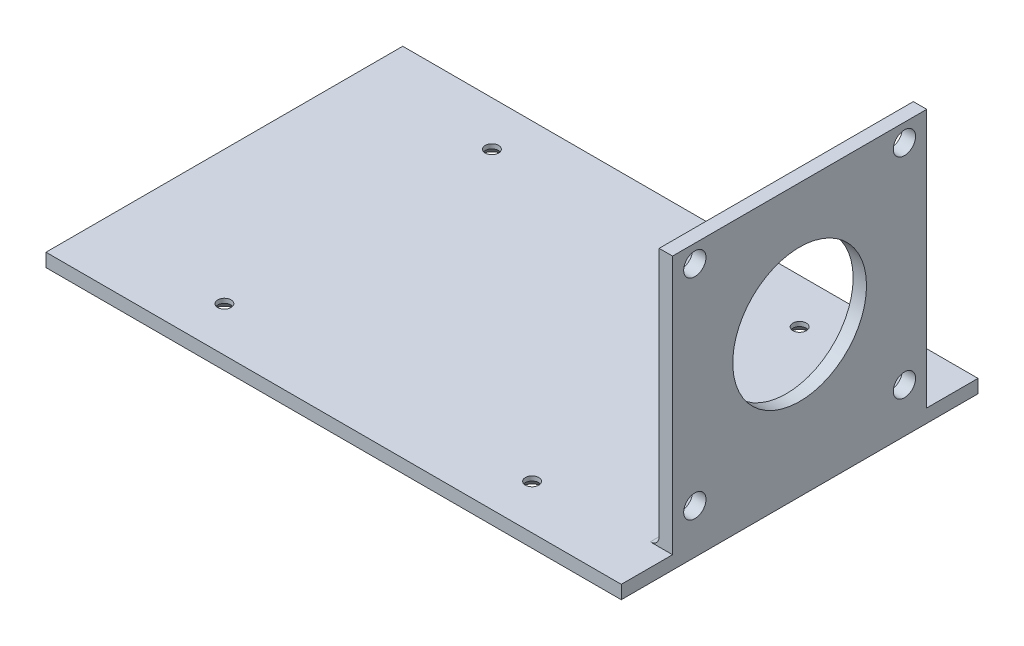
ISO-10303-21;
HEADER;
FILE_DESCRIPTION(('STEP AP214'),'2;1');
FILE_NAME('part.step','',(''),(''),'','','');
FILE_SCHEMA(('AUTOMOTIVE_DESIGN { 1 0 10303 214 1 1 1 1 }'));
ENDSEC;
DATA;
#1=APPLICATION_CONTEXT('core data for automotive mechanical design processes');
#2=APPLICATION_PROTOCOL_DEFINITION('international standard','automotive_design',2000,#1);
#3=PRODUCT_CONTEXT('',#1,'mechanical');
#4=PRODUCT('Part','Part','',(#3));
#5=PRODUCT_RELATED_PRODUCT_CATEGORY('part','',(#4));
#6=PRODUCT_DEFINITION_FORMATION('','',#4);
#7=PRODUCT_DEFINITION_CONTEXT('part definition',#1,'design');
#8=PRODUCT_DEFINITION('design','',#6,#7);
#9=PRODUCT_DEFINITION_SHAPE('','',#8);
#10=(LENGTH_UNIT() NAMED_UNIT(*) SI_UNIT(.MILLI.,.METRE.));
#11=(NAMED_UNIT(*) PLANE_ANGLE_UNIT() SI_UNIT($,.RADIAN.));
#12=(NAMED_UNIT(*) SI_UNIT($,.STERADIAN.) SOLID_ANGLE_UNIT());
#13=UNCERTAINTY_MEASURE_WITH_UNIT(LENGTH_MEASURE(1.E-05),#10,'distance_accuracy_value','');
#14=(GEOMETRIC_REPRESENTATION_CONTEXT(3) GLOBAL_UNCERTAINTY_ASSIGNED_CONTEXT((#13)) GLOBAL_UNIT_ASSIGNED_CONTEXT((#10,
#11,#12)) REPRESENTATION_CONTEXT('',''));
#15=CARTESIAN_POINT('',(0.,0.,0.));
#16=DIRECTION('',(0.,0.,1.));
#17=DIRECTION('',(1.,0.,0.));
#18=AXIS2_PLACEMENT_3D('',#15,#16,#17);
#19=CARTESIAN_POINT('',(129.,3.,0.));
#20=DIRECTION('',(-1.,0.,0.));
#21=DIRECTION('',(0.,0.,1.));
#22=AXIS2_PLACEMENT_3D('',#19,#20,#21);
#23=PLANE('',#22);
#24=CARTESIAN_POINT('',(129.,10.,-63.5));
#25=DIRECTION('',(-1.,0.,0.));
#26=DIRECTION('',(0.,0.,1.));
#27=AXIS2_PLACEMENT_3D('',#24,#25,#26);
#28=CIRCLE('',#27,2.5);
#29=CARTESIAN_POINT('',(129.,10.,-61.));
#30=VERTEX_POINT('',#29);
#31=EDGE_CURVE('E507',#30,#30,#28,.T.);
#32=ORIENTED_EDGE('',*,*,#31,.T.);
#33=EDGE_LOOP('',(#32));
#34=FACE_BOUND('',#33,.T.);
#35=CARTESIAN_POINT('',(129.,57.,-63.5));
#36=DIRECTION('',(1.,0.,0.));
#37=DIRECTION('',(0.,0.,-1.));
#38=AXIS2_PLACEMENT_3D('',#35,#36,#37);
#39=CIRCLE('',#38,2.5);
#40=CARTESIAN_POINT('',(129.,57.,-66.));
#41=VERTEX_POINT('',#40);
#42=EDGE_CURVE('E515',#41,#41,#39,.T.);
#43=ORIENTED_EDGE('',*,*,#42,.F.);
#44=EDGE_LOOP('',(#43));
#45=FACE_BOUND('',#44,.T.);
#46=DIRECTION('',(0.,0.,-1.));
#47=VECTOR('',#46,1.);
#48=CARTESIAN_POINT('',(129.,0.,0.));
#49=LINE('',#48,#47);
#50=CARTESIAN_POINT('',(129.,0.,0.));
#51=VERTEX_POINT('',#50);
#52=CARTESIAN_POINT('',(129.,0.,-80.));
#53=VERTEX_POINT('',#52);
#54=EDGE_CURVE('E165',#51,#53,#49,.T.);
#55=ORIENTED_EDGE('',*,*,#54,.T.);
#56=DIRECTION('',(0.,-1.,0.));
#57=VECTOR('',#56,1.);
#58=CARTESIAN_POINT('',(129.,3.,-80.));
#59=LINE('',#58,#57);
#60=CARTESIAN_POINT('',(129.,3.,-80.));
#61=VERTEX_POINT('',#60);
#62=EDGE_CURVE('E170',#61,#53,#59,.T.);
#63=ORIENTED_EDGE('',*,*,#62,.F.);
#64=DIRECTION('',(0.,0.,-1.));
#65=VECTOR('',#64,1.);
#66=CARTESIAN_POINT('',(129.,3.,0.));
#67=LINE('',#66,#65);
#68=CARTESIAN_POINT('',(129.,3.,-68.5));
#69=VERTEX_POINT('',#68);
#70=EDGE_CURVE('E155',#69,#61,#67,.T.);
#71=ORIENTED_EDGE('',*,*,#70,.F.);
#72=DIRECTION('',(0.,-1.,0.));
#73=VECTOR('',#72,1.);
#74=CARTESIAN_POINT('',(129.,61.,-68.5));
#75=LINE('',#74,#73);
#76=CARTESIAN_POINT('',(129.,61.,-68.5));
#77=VERTEX_POINT('',#76);
#78=EDGE_CURVE('E265',#77,#69,#75,.T.);
#79=ORIENTED_EDGE('',*,*,#78,.F.);
#80=DIRECTION('',(0.,0.,-1.));
#81=VECTOR('',#80,1.);
#82=CARTESIAN_POINT('',(129.,61.,-68.5));
#83=LINE('',#82,#81);
#84=CARTESIAN_POINT('',(129.,61.,-11.5));
#85=VERTEX_POINT('',#84);
#86=EDGE_CURVE('E125',#85,#77,#83,.T.);
#87=ORIENTED_EDGE('',*,*,#86,.F.);
#88=DIRECTION('',(0.,-1.,0.));
#89=VECTOR('',#88,1.);
#90=CARTESIAN_POINT('',(129.,61.,-11.5));
#91=LINE('',#90,#89);
#92=CARTESIAN_POINT('',(129.,3.,-11.5));
#93=VERTEX_POINT('',#92);
#94=EDGE_CURVE('E136',#85,#93,#91,.T.);
#95=ORIENTED_EDGE('',*,*,#94,.T.);
#96=CARTESIAN_POINT('',(129.,3.,0.));
#97=VERTEX_POINT('',#96);
#98=EDGE_CURVE('E156',#97,#93,#67,.T.);
#99=ORIENTED_EDGE('',*,*,#98,.F.);
#100=DIRECTION('',(0.,-1.,0.));
#101=VECTOR('',#100,1.);
#102=CARTESIAN_POINT('',(129.,3.,0.));
#103=LINE('',#102,#101);
#104=EDGE_CURVE('E173',#97,#51,#103,.T.);
#105=ORIENTED_EDGE('',*,*,#104,.T.);
#106=EDGE_LOOP('',(#55,#63,#71,#79,#87,#95,#99,#105));
#107=FACE_BOUND('',#106,.T.);
#108=CARTESIAN_POINT('',(129.,57.,-16.5));
#109=DIRECTION('',(1.,0.,0.));
#110=DIRECTION('',(0.,0.,-1.));
#111=AXIS2_PLACEMENT_3D('',#108,#109,#110);
#112=CIRCLE('',#111,2.5);
#113=CARTESIAN_POINT('',(129.,57.,-19.));
#114=VERTEX_POINT('',#113);
#115=EDGE_CURVE('E191',#114,#114,#112,.F.);
#116=ORIENTED_EDGE('',*,*,#115,.T.);
#117=EDGE_LOOP('',(#116));
#118=FACE_BOUND('',#117,.T.);
#119=CARTESIAN_POINT('',(129.,33.5,-40.));
#120=DIRECTION('',(1.,0.,0.));
#121=DIRECTION('',(0.,0.,-1.));
#122=AXIS2_PLACEMENT_3D('',#119,#120,#121);
#123=CIRCLE('',#122,15.);
#124=CARTESIAN_POINT('',(129.,33.5,-55.));
#125=VERTEX_POINT('',#124);
#126=EDGE_CURVE('E520',#125,#125,#123,.T.);
#127=ORIENTED_EDGE('',*,*,#126,.F.);
#128=EDGE_LOOP('',(#127));
#129=FACE_BOUND('',#128,.T.);
#130=CARTESIAN_POINT('',(129.,10.,-16.5));
#131=DIRECTION('',(1.,0.,0.));
#132=DIRECTION('',(0.,0.,-1.));
#133=AXIS2_PLACEMENT_3D('',#130,#131,#132);
#134=CIRCLE('',#133,2.5);
#135=CARTESIAN_POINT('',(129.,10.,-19.));
#136=VERTEX_POINT('',#135);
#137=EDGE_CURVE('E512',#136,#136,#134,.T.);
#138=ORIENTED_EDGE('',*,*,#137,.F.);
#139=EDGE_LOOP('',(#138));
#140=FACE_BOUND('',#139,.T.);
#141=ADVANCED_FACE('F35',(#34,#45,#107,#118,#129,#140),#23,.F.);
#142=CARTESIAN_POINT('',(126.,61.,-68.5));
#143=DIRECTION('',(1.,0.,0.));
#144=DIRECTION('',(0.,0.,-1.));
#145=AXIS2_PLACEMENT_3D('',#142,#143,#144);
#146=PLANE('',#145);
#147=CARTESIAN_POINT('',(126.,10.,-63.5));
#148=DIRECTION('',(1.,0.,0.));
#149=DIRECTION('',(0.,0.,-1.));
#150=AXIS2_PLACEMENT_3D('',#147,#148,#149);
#151=CIRCLE('',#150,2.5);
#152=CARTESIAN_POINT('',(126.,10.,-66.));
#153=VERTEX_POINT('',#152);
#154=EDGE_CURVE('E200',#153,#153,#151,.F.);
#155=ORIENTED_EDGE('',*,*,#154,.F.);
#156=EDGE_LOOP('',(#155));
#157=FACE_BOUND('',#156,.T.);
#158=CARTESIAN_POINT('',(126.,57.,-63.5));
#159=DIRECTION('',(1.,0.,0.));
#160=DIRECTION('',(0.,0.,-1.));
#161=AXIS2_PLACEMENT_3D('',#158,#159,#160);
#162=CIRCLE('',#161,2.5);
#163=CARTESIAN_POINT('',(126.,57.,-66.));
#164=VERTEX_POINT('',#163);
#165=EDGE_CURVE('E194',#164,#164,#162,.T.);
#166=ORIENTED_EDGE('',*,*,#165,.T.);
#167=EDGE_LOOP('',(#166));
#168=FACE_BOUND('',#167,.T.);
#169=DIRECTION('',(0.,-1.,0.));
#170=VECTOR('',#169,1.);
#171=CARTESIAN_POINT('',(126.,61.,-68.5));
#172=LINE('',#171,#170);
#173=CARTESIAN_POINT('',(126.,61.,-68.5));
#174=VERTEX_POINT('',#173);
#175=CARTESIAN_POINT('',(126.,5.00000000000001,-68.5));
#176=VERTEX_POINT('',#175);
#177=EDGE_CURVE('E113',#174,#176,#172,.T.);
#178=ORIENTED_EDGE('',*,*,#177,.T.);
#179=DIRECTION('',(0.,0.,1.));
#180=VECTOR('',#179,1.);
#181=CARTESIAN_POINT('',(126.,5.,-11.5));
#182=LINE('',#181,#180);
#183=CARTESIAN_POINT('',(126.,5.00000000000001,-11.5));
#184=VERTEX_POINT('',#183);
#185=EDGE_CURVE('E179',#176,#184,#182,.T.);
#186=ORIENTED_EDGE('',*,*,#185,.T.);
#187=DIRECTION('',(0.,-1.,0.));
#188=VECTOR('',#187,1.);
#189=CARTESIAN_POINT('',(126.,61.,-11.5));
#190=LINE('',#189,#188);
#191=CARTESIAN_POINT('',(126.,61.,-11.5));
#192=VERTEX_POINT('',#191);
#193=EDGE_CURVE('E116',#192,#184,#190,.T.);
#194=ORIENTED_EDGE('',*,*,#193,.F.);
#195=DIRECTION('',(0.,0.,1.));
#196=VECTOR('',#195,1.);
#197=CARTESIAN_POINT('',(126.,61.,-68.5));
#198=LINE('',#197,#196);
#199=EDGE_CURVE('E107',#174,#192,#198,.T.);
#200=ORIENTED_EDGE('',*,*,#199,.F.);
#201=EDGE_LOOP('',(#178,#186,#194,#200));
#202=FACE_BOUND('',#201,.T.);
#203=CARTESIAN_POINT('',(126.,57.,-16.5));
#204=DIRECTION('',(1.,0.,0.));
#205=DIRECTION('',(0.,0.,-1.));
#206=AXIS2_PLACEMENT_3D('',#203,#204,#205);
#207=CIRCLE('',#206,2.5);
#208=CARTESIAN_POINT('',(126.,57.,-19.));
#209=VERTEX_POINT('',#208);
#210=EDGE_CURVE('E187',#209,#209,#207,.F.);
#211=ORIENTED_EDGE('',*,*,#210,.F.);
#212=EDGE_LOOP('',(#211));
#213=FACE_BOUND('',#212,.T.);
#214=CARTESIAN_POINT('',(126.,33.5,-40.));
#215=DIRECTION('',(1.,0.,0.));
#216=DIRECTION('',(0.,0.,-1.));
#217=AXIS2_PLACEMENT_3D('',#214,#215,#216);
#218=CIRCLE('',#217,15.);
#219=CARTESIAN_POINT('',(126.,33.5,-55.));
#220=VERTEX_POINT('',#219);
#221=EDGE_CURVE('E190',#220,#220,#218,.T.);
#222=ORIENTED_EDGE('',*,*,#221,.T.);
#223=EDGE_LOOP('',(#222));
#224=FACE_BOUND('',#223,.T.);
#225=CARTESIAN_POINT('',(126.,10.,-16.5));
#226=DIRECTION('',(1.,0.,0.));
#227=DIRECTION('',(0.,0.,-1.));
#228=AXIS2_PLACEMENT_3D('',#225,#226,#227);
#229=CIRCLE('',#228,2.5);
#230=CARTESIAN_POINT('',(126.,10.,-19.));
#231=VERTEX_POINT('',#230);
#232=EDGE_CURVE('E197',#231,#231,#229,.T.);
#233=ORIENTED_EDGE('',*,*,#232,.T.);
#234=EDGE_LOOP('',(#233));
#235=FACE_BOUND('',#234,.T.);
#236=ADVANCED_FACE('F109',(#157,#168,#202,#213,#224,#235),#146,.F.);
#237=CARTESIAN_POINT('',(0.,3.,0.));
#238=DIRECTION('',(0.,-1.,0.));
#239=DIRECTION('',(0.,0.,-1.));
#240=AXIS2_PLACEMENT_3D('',#237,#238,#239);
#241=PLANE('',#240);
#242=CARTESIAN_POINT('',(30.,3.,-10.));
#243=DIRECTION('',(0.,1.,0.));
#244=DIRECTION('',(0.,0.,-1.));
#245=AXIS2_PLACEMENT_3D('',#242,#243,#244);
#246=CIRCLE('',#245,1.5);
#247=CARTESIAN_POINT('',(30.,3.,-11.5));
#248=VERTEX_POINT('',#247);
#249=EDGE_CURVE('E131',#248,#248,#246,.T.);
#250=ORIENTED_EDGE('',*,*,#249,.F.);
#251=EDGE_LOOP('',(#250));
#252=FACE_BOUND('',#251,.T.);
#253=CARTESIAN_POINT('',(99.,3.,-9.99999999999999));
#254=DIRECTION('',(0.,1.,0.));
#255=DIRECTION('',(0.,0.,-1.));
#256=AXIS2_PLACEMENT_3D('',#253,#254,#255);
#257=CIRCLE('',#256,1.5);
#258=CARTESIAN_POINT('',(99.,3.,-11.5));
#259=VERTEX_POINT('',#258);
#260=EDGE_CURVE('E134',#259,#259,#257,.T.);
#261=ORIENTED_EDGE('',*,*,#260,.F.);
#262=EDGE_LOOP('',(#261));
#263=FACE_BOUND('',#262,.T.);
#264=CARTESIAN_POINT('',(30.,3.,-70.));
#265=DIRECTION('',(0.,1.,0.));
#266=DIRECTION('',(0.,0.,1.));
#267=AXIS2_PLACEMENT_3D('',#264,#265,#266);
#268=CIRCLE('',#267,1.5);
#269=CARTESIAN_POINT('',(30.,3.,-68.5));
#270=VERTEX_POINT('',#269);
#271=EDGE_CURVE('E142',#270,#270,#268,.T.);
#272=ORIENTED_EDGE('',*,*,#271,.F.);
#273=EDGE_LOOP('',(#272));
#274=FACE_BOUND('',#273,.T.);
#275=CARTESIAN_POINT('',(99.,3.,-70.));
#276=DIRECTION('',(0.,1.,0.));
#277=DIRECTION('',(0.,0.,1.));
#278=AXIS2_PLACEMENT_3D('',#275,#276,#277);
#279=CIRCLE('',#278,1.5);
#280=CARTESIAN_POINT('',(99.,3.,-68.5));
#281=VERTEX_POINT('',#280);
#282=EDGE_CURVE('E145',#281,#281,#279,.T.);
#283=ORIENTED_EDGE('',*,*,#282,.F.);
#284=EDGE_LOOP('',(#283));
#285=FACE_BOUND('',#284,.T.);
#286=DIRECTION('',(1.,0.,0.));
#287=VECTOR('',#286,1.);
#288=CARTESIAN_POINT('',(126.,3.,-11.5));
#289=LINE('',#288,#287);
#290=CARTESIAN_POINT('',(124.,3.,-11.5));
#291=VERTEX_POINT('',#290);
#292=EDGE_CURVE('E51',#291,#93,#289,.T.);
#293=ORIENTED_EDGE('',*,*,#292,.F.);
#294=DIRECTION('',(0.,0.,1.));
#295=VECTOR('',#294,1.);
#296=CARTESIAN_POINT('',(124.,3.,-68.5));
#297=LINE('',#296,#295);
#298=CARTESIAN_POINT('',(124.,3.,-68.5));
#299=VERTEX_POINT('',#298);
#300=EDGE_CURVE('E181',#291,#299,#297,.F.);
#301=ORIENTED_EDGE('',*,*,#300,.T.);
#302=DIRECTION('',(-1.,0.,0.));
#303=VECTOR('',#302,1.);
#304=CARTESIAN_POINT('',(129.,3.,-68.5));
#305=LINE('',#304,#303);
#306=EDGE_CURVE('E59',#69,#299,#305,.T.);
#307=ORIENTED_EDGE('',*,*,#306,.F.);
#308=ORIENTED_EDGE('',*,*,#70,.T.);
#309=DIRECTION('',(-1.,0.,0.));
#310=VECTOR('',#309,1.);
#311=CARTESIAN_POINT('',(0.,3.,-80.));
#312=LINE('',#311,#310);
#313=CARTESIAN_POINT('',(0.,3.,-80.));
#314=VERTEX_POINT('',#313);
#315=EDGE_CURVE('E158',#61,#314,#312,.T.);
#316=ORIENTED_EDGE('',*,*,#315,.T.);
#317=DIRECTION('',(0.,0.,1.));
#318=VECTOR('',#317,1.);
#319=CARTESIAN_POINT('',(0.,3.,0.));
#320=LINE('',#319,#318);
#321=CARTESIAN_POINT('',(0.,3.,0.));
#322=VERTEX_POINT('',#321);
#323=EDGE_CURVE('E149',#314,#322,#320,.T.);
#324=ORIENTED_EDGE('',*,*,#323,.T.);
#325=DIRECTION('',(1.,0.,0.));
#326=VECTOR('',#325,1.);
#327=CARTESIAN_POINT('',(0.,3.,0.));
#328=LINE('',#327,#326);
#329=EDGE_CURVE('E152',#322,#97,#328,.T.);
#330=ORIENTED_EDGE('',*,*,#329,.T.);
#331=ORIENTED_EDGE('',*,*,#98,.T.);
#332=EDGE_LOOP('',(#293,#301,#307,#308,#316,#324,#330,#331));
#333=FACE_BOUND('',#332,.T.);
#334=ADVANCED_FACE('F235',(#252,#263,#274,#285,#333),#241,.F.);
#335=CARTESIAN_POINT('',(0.,0.,0.));
#336=DIRECTION('',(0.,-1.,0.));
#337=DIRECTION('',(0.,0.,-1.));
#338=AXIS2_PLACEMENT_3D('',#335,#336,#337);
#339=PLANE('',#338);
#340=CARTESIAN_POINT('',(30.,0.,-10.));
#341=DIRECTION('',(0.,-1.,0.));
#342=DIRECTION('',(0.,0.,-1.));
#343=AXIS2_PLACEMENT_3D('',#340,#341,#342);
#344=CIRCLE('',#343,3.5);
#345=CARTESIAN_POINT('',(30.,0.,-13.5));
#346=VERTEX_POINT('',#345);
#347=EDGE_CURVE('E211',#346,#346,#344,.F.);
#348=ORIENTED_EDGE('',*,*,#347,.T.);
#349=EDGE_LOOP('',(#348));
#350=FACE_BOUND('',#349,.T.);
#351=CARTESIAN_POINT('',(30.,0.,-70.));
#352=DIRECTION('',(0.,-1.,0.));
#353=DIRECTION('',(0.,0.,-1.));
#354=AXIS2_PLACEMENT_3D('',#351,#352,#353);
#355=CIRCLE('',#354,3.50000000000002);
#356=CARTESIAN_POINT('',(30.,0.,-73.5));
#357=VERTEX_POINT('',#356);
#358=EDGE_CURVE('E208',#357,#357,#355,.F.);
#359=ORIENTED_EDGE('',*,*,#358,.T.);
#360=EDGE_LOOP('',(#359));
#361=FACE_BOUND('',#360,.T.);
#362=CARTESIAN_POINT('',(99.,0.,-70.));
#363=DIRECTION('',(0.,-1.,0.));
#364=DIRECTION('',(0.,0.,-1.));
#365=AXIS2_PLACEMENT_3D('',#362,#363,#364);
#366=CIRCLE('',#365,3.5);
#367=CARTESIAN_POINT('',(99.,0.,-73.5));
#368=VERTEX_POINT('',#367);
#369=EDGE_CURVE('E205',#368,#368,#366,.F.);
#370=ORIENTED_EDGE('',*,*,#369,.T.);
#371=EDGE_LOOP('',(#370));
#372=FACE_BOUND('',#371,.T.);
#373=CARTESIAN_POINT('',(99.,0.,-9.99999999999999));
#374=DIRECTION('',(0.,-1.,0.));
#375=DIRECTION('',(0.,0.,-1.));
#376=AXIS2_PLACEMENT_3D('',#373,#374,#375);
#377=CIRCLE('',#376,3.5);
#378=CARTESIAN_POINT('',(99.,0.,-13.5));
#379=VERTEX_POINT('',#378);
#380=EDGE_CURVE('E186',#379,#379,#377,.F.);
#381=ORIENTED_EDGE('',*,*,#380,.T.);
#382=EDGE_LOOP('',(#381));
#383=FACE_BOUND('',#382,.T.);
#384=DIRECTION('',(0.,0.,1.));
#385=VECTOR('',#384,1.);
#386=CARTESIAN_POINT('',(0.,0.,0.));
#387=LINE('',#386,#385);
#388=CARTESIAN_POINT('',(0.,0.,-80.));
#389=VERTEX_POINT('',#388);
#390=CARTESIAN_POINT('',(0.,0.,0.));
#391=VERTEX_POINT('',#390);
#392=EDGE_CURVE('E148',#389,#391,#387,.T.);
#393=ORIENTED_EDGE('',*,*,#392,.F.);
#394=DIRECTION('',(-1.,0.,0.));
#395=VECTOR('',#394,1.);
#396=CARTESIAN_POINT('',(0.,0.,-80.));
#397=LINE('',#396,#395);
#398=EDGE_CURVE('E153',#53,#389,#397,.T.);
#399=ORIENTED_EDGE('',*,*,#398,.F.);
#400=ORIENTED_EDGE('',*,*,#54,.F.);
#401=DIRECTION('',(1.,0.,0.));
#402=VECTOR('',#401,1.);
#403=CARTESIAN_POINT('',(0.,0.,0.));
#404=LINE('',#403,#402);
#405=EDGE_CURVE('E163',#391,#51,#404,.T.);
#406=ORIENTED_EDGE('',*,*,#405,.F.);
#407=EDGE_LOOP('',(#393,#399,#400,#406));
#408=FACE_BOUND('',#407,.T.);
#409=ADVANCED_FACE('F231',(#350,#361,#372,#383,#408),#339,.T.);
#410=CARTESIAN_POINT('',(0.,3.,0.));
#411=DIRECTION('',(1.,0.,0.));
#412=DIRECTION('',(0.,0.,-1.));
#413=AXIS2_PLACEMENT_3D('',#410,#411,#412);
#414=PLANE('',#413);
#415=ORIENTED_EDGE('',*,*,#392,.T.);
#416=DIRECTION('',(0.,-1.,0.));
#417=VECTOR('',#416,1.);
#418=CARTESIAN_POINT('',(0.,3.,0.));
#419=LINE('',#418,#417);
#420=EDGE_CURVE('E176',#322,#391,#419,.T.);
#421=ORIENTED_EDGE('',*,*,#420,.F.);
#422=ORIENTED_EDGE('',*,*,#323,.F.);
#423=DIRECTION('',(0.,-1.,0.));
#424=VECTOR('',#423,1.);
#425=CARTESIAN_POINT('',(0.,3.,-80.));
#426=LINE('',#425,#424);
#427=EDGE_CURVE('E160',#314,#389,#426,.T.);
#428=ORIENTED_EDGE('',*,*,#427,.T.);
#429=EDGE_LOOP('',(#415,#421,#422,#428));
#430=FACE_BOUND('',#429,.T.);
#431=ADVANCED_FACE('F234',(#430),#414,.F.);
#432=CARTESIAN_POINT('',(0.,3.,0.));
#433=DIRECTION('',(0.,0.,-1.));
#434=DIRECTION('',(-1.,0.,0.));
#435=AXIS2_PLACEMENT_3D('',#432,#433,#434);
#436=PLANE('',#435);
#437=ORIENTED_EDGE('',*,*,#405,.T.);
#438=ORIENTED_EDGE('',*,*,#104,.F.);
#439=ORIENTED_EDGE('',*,*,#329,.F.);
#440=ORIENTED_EDGE('',*,*,#420,.T.);
#441=EDGE_LOOP('',(#437,#438,#439,#440));
#442=FACE_BOUND('',#441,.T.);
#443=ADVANCED_FACE('F258',(#442),#436,.F.);
#444=CARTESIAN_POINT('',(0.,3.,-80.));
#445=DIRECTION('',(0.,0.,1.));
#446=DIRECTION('',(1.,0.,0.));
#447=AXIS2_PLACEMENT_3D('',#444,#445,#446);
#448=PLANE('',#447);
#449=ORIENTED_EDGE('',*,*,#398,.T.);
#450=ORIENTED_EDGE('',*,*,#427,.F.);
#451=ORIENTED_EDGE('',*,*,#315,.F.);
#452=ORIENTED_EDGE('',*,*,#62,.T.);
#453=EDGE_LOOP('',(#449,#450,#451,#452));
#454=FACE_BOUND('',#453,.T.);
#455=ADVANCED_FACE('F249',(#454),#448,.F.);
#456=CARTESIAN_POINT('',(99.,3.,-70.));
#457=DIRECTION('',(0.,-1.,0.));
#458=DIRECTION('',(0.,0.,-1.));
#459=AXIS2_PLACEMENT_3D('',#456,#457,#458);
#460=CYLINDRICAL_SURFACE('',#459,1.5);
#461=CARTESIAN_POINT('',(99.,2.00000000000003,-70.));
#462=DIRECTION('',(0.,-1.,0.));
#463=DIRECTION('',(0.,0.,-1.));
#464=AXIS2_PLACEMENT_3D('',#461,#462,#463);
#465=CIRCLE('',#464,1.5);
#466=CARTESIAN_POINT('',(99.,2.00000000000003,-71.5));
#467=VERTEX_POINT('',#466);
#468=EDGE_CURVE('E44',#467,#467,#465,.T.);
#469=ORIENTED_EDGE('',*,*,#468,.T.);
#470=EDGE_LOOP('',(#469));
#471=FACE_BOUND('',#470,.T.);
#472=ORIENTED_EDGE('',*,*,#282,.T.);
#473=EDGE_LOOP('',(#472));
#474=FACE_BOUND('',#473,.T.);
#475=ADVANCED_FACE('F222',(#471,#474),#460,.F.);
#476=CARTESIAN_POINT('',(30.,3.,-70.));
#477=DIRECTION('',(0.,-1.,0.));
#478=DIRECTION('',(0.,0.,-1.));
#479=AXIS2_PLACEMENT_3D('',#476,#477,#478);
#480=CYLINDRICAL_SURFACE('',#479,1.5);
#481=CARTESIAN_POINT('',(30.,2.00000000000002,-70.));
#482=DIRECTION('',(0.,-1.,0.));
#483=DIRECTION('',(0.,0.,-1.));
#484=AXIS2_PLACEMENT_3D('',#481,#482,#483);
#485=CIRCLE('',#484,1.5);
#486=CARTESIAN_POINT('',(30.,2.00000000000002,-71.5));
#487=VERTEX_POINT('',#486);
#488=EDGE_CURVE('E217',#487,#487,#485,.T.);
#489=ORIENTED_EDGE('',*,*,#488,.T.);
#490=EDGE_LOOP('',(#489));
#491=FACE_BOUND('',#490,.T.);
#492=ORIENTED_EDGE('',*,*,#271,.T.);
#493=EDGE_LOOP('',(#492));
#494=FACE_BOUND('',#493,.T.);
#495=ADVANCED_FACE('F319',(#491,#494),#480,.F.);
#496=CARTESIAN_POINT('',(99.,3.,-9.99999999999999));
#497=DIRECTION('',(0.,-1.,0.));
#498=DIRECTION('',(0.,0.,-1.));
#499=AXIS2_PLACEMENT_3D('',#496,#497,#498);
#500=CYLINDRICAL_SURFACE('',#499,1.5);
#501=CARTESIAN_POINT('',(99.,2.,-9.99999999999999));
#502=DIRECTION('',(0.,-1.,0.));
#503=DIRECTION('',(0.,0.,-1.));
#504=AXIS2_PLACEMENT_3D('',#501,#502,#503);
#505=CIRCLE('',#504,1.5);
#506=CARTESIAN_POINT('',(99.,2.,-11.5));
#507=VERTEX_POINT('',#506);
#508=EDGE_CURVE('E11',#507,#507,#505,.T.);
#509=ORIENTED_EDGE('',*,*,#508,.T.);
#510=EDGE_LOOP('',(#509));
#511=FACE_BOUND('',#510,.T.);
#512=ORIENTED_EDGE('',*,*,#260,.T.);
#513=EDGE_LOOP('',(#512));
#514=FACE_BOUND('',#513,.T.);
#515=ADVANCED_FACE('F326',(#511,#514),#500,.F.);
#516=CARTESIAN_POINT('',(30.,3.,-10.));
#517=DIRECTION('',(0.,-1.,0.));
#518=DIRECTION('',(0.,0.,-1.));
#519=AXIS2_PLACEMENT_3D('',#516,#517,#518);
#520=CYLINDRICAL_SURFACE('',#519,1.5);
#521=CARTESIAN_POINT('',(30.,1.99999999999999,-10.));
#522=DIRECTION('',(0.,-1.,0.));
#523=DIRECTION('',(0.,0.,-1.));
#524=AXIS2_PLACEMENT_3D('',#521,#522,#523);
#525=CIRCLE('',#524,1.5);
#526=CARTESIAN_POINT('',(30.,1.99999999999999,-11.5));
#527=VERTEX_POINT('',#526);
#528=EDGE_CURVE('E214',#527,#527,#525,.T.);
#529=ORIENTED_EDGE('',*,*,#528,.T.);
#530=EDGE_LOOP('',(#529));
#531=FACE_BOUND('',#530,.T.);
#532=ORIENTED_EDGE('',*,*,#249,.T.);
#533=EDGE_LOOP('',(#532));
#534=FACE_BOUND('',#533,.T.);
#535=ADVANCED_FACE('F334',(#531,#534),#520,.F.);
#536=CARTESIAN_POINT('',(129.,61.,-68.5));
#537=DIRECTION('',(0.,0.,1.));
#538=DIRECTION('',(1.,0.,0.));
#539=AXIS2_PLACEMENT_3D('',#536,#537,#538);
#540=PLANE('',#539);
#541=ORIENTED_EDGE('',*,*,#306,.T.);
#542=CARTESIAN_POINT('',(124.,5.,-68.5));
#543=DIRECTION('',(0.,0.,1.));
#544=DIRECTION('',(1.,0.,0.));
#545=AXIS2_PLACEMENT_3D('',#542,#543,#544);
#546=CIRCLE('',#545,2.);
#547=EDGE_CURVE('E130',#299,#176,#546,.T.);
#548=ORIENTED_EDGE('',*,*,#547,.T.);
#549=ORIENTED_EDGE('',*,*,#177,.F.);
#550=DIRECTION('',(-1.,0.,0.));
#551=VECTOR('',#550,1.);
#552=CARTESIAN_POINT('',(129.,61.,-68.5));
#553=LINE('',#552,#551);
#554=EDGE_CURVE('E120',#77,#174,#553,.T.);
#555=ORIENTED_EDGE('',*,*,#554,.F.);
#556=ORIENTED_EDGE('',*,*,#78,.T.);
#557=EDGE_LOOP('',(#541,#548,#549,#555,#556));
#558=FACE_BOUND('',#557,.T.);
#559=ADVANCED_FACE('F128',(#558),#540,.F.);
#560=CARTESIAN_POINT('',(126.,61.,-11.5));
#561=DIRECTION('',(0.,0.,-1.));
#562=DIRECTION('',(-1.,0.,0.));
#563=AXIS2_PLACEMENT_3D('',#560,#561,#562);
#564=PLANE('',#563);
#565=ORIENTED_EDGE('',*,*,#292,.T.);
#566=ORIENTED_EDGE('',*,*,#94,.F.);
#567=DIRECTION('',(1.,0.,0.));
#568=VECTOR('',#567,1.);
#569=CARTESIAN_POINT('',(126.,61.,-11.5));
#570=LINE('',#569,#568);
#571=EDGE_CURVE('E119',#192,#85,#570,.T.);
#572=ORIENTED_EDGE('',*,*,#571,.F.);
#573=ORIENTED_EDGE('',*,*,#193,.T.);
#574=CARTESIAN_POINT('',(124.,5.,-11.5));
#575=DIRECTION('',(0.,0.,-1.));
#576=DIRECTION('',(-1.,0.,0.));
#577=AXIS2_PLACEMENT_3D('',#574,#575,#576);
#578=CIRCLE('',#577,2.);
#579=EDGE_CURVE('E183',#184,#291,#578,.T.);
#580=ORIENTED_EDGE('',*,*,#579,.T.);
#581=EDGE_LOOP('',(#565,#566,#572,#573,#580));
#582=FACE_BOUND('',#581,.T.);
#583=ADVANCED_FACE('F268',(#582),#564,.F.);
#584=CARTESIAN_POINT('',(0.,61.,0.));
#585=DIRECTION('',(0.,1.,0.));
#586=DIRECTION('',(0.,0.,1.));
#587=AXIS2_PLACEMENT_3D('',#584,#585,#586);
#588=PLANE('',#587);
#589=ORIENTED_EDGE('',*,*,#554,.T.);
#590=ORIENTED_EDGE('',*,*,#199,.T.);
#591=ORIENTED_EDGE('',*,*,#571,.T.);
#592=ORIENTED_EDGE('',*,*,#86,.T.);
#593=EDGE_LOOP('',(#589,#590,#591,#592));
#594=FACE_BOUND('',#593,.T.);
#595=ADVANCED_FACE('F123',(#594),#588,.T.);
#596=CARTESIAN_POINT('',(124.,5.,-68.5));
#597=DIRECTION('',(0.,0.,-1.));
#598=DIRECTION('',(-1.,0.,0.));
#599=AXIS2_PLACEMENT_3D('',#596,#597,#598);
#600=CYLINDRICAL_SURFACE('',#599,2.);
#601=ORIENTED_EDGE('',*,*,#547,.F.);
#602=ORIENTED_EDGE('',*,*,#300,.F.);
#603=ORIENTED_EDGE('',*,*,#579,.F.);
#604=ORIENTED_EDGE('',*,*,#185,.F.);
#605=EDGE_LOOP('',(#601,#602,#603,#604));
#606=FACE_BOUND('',#605,.T.);
#607=ADVANCED_FACE('F270',(#606),#600,.F.);
#608=CARTESIAN_POINT('',(0.,57.,-16.5));
#609=DIRECTION('',(1.,0.,0.));
#610=DIRECTION('',(0.,0.,-1.));
#611=AXIS2_PLACEMENT_3D('',#608,#609,#610);
#612=CYLINDRICAL_SURFACE('',#611,2.5);
#613=ORIENTED_EDGE('',*,*,#115,.F.);
#614=EDGE_LOOP('',(#613));
#615=FACE_BOUND('',#614,.T.);
#616=ORIENTED_EDGE('',*,*,#210,.T.);
#617=EDGE_LOOP('',(#616));
#618=FACE_BOUND('',#617,.T.);
#619=ADVANCED_FACE('F272',(#615,#618),#612,.F.);
#620=CARTESIAN_POINT('',(0.,33.5,-40.));
#621=DIRECTION('',(1.,0.,0.));
#622=DIRECTION('',(0.,0.,-1.));
#623=AXIS2_PLACEMENT_3D('',#620,#621,#622);
#624=CYLINDRICAL_SURFACE('',#623,15.);
#625=ORIENTED_EDGE('',*,*,#126,.T.);
#626=EDGE_LOOP('',(#625));
#627=FACE_BOUND('',#626,.T.);
#628=ORIENTED_EDGE('',*,*,#221,.F.);
#629=EDGE_LOOP('',(#628));
#630=FACE_BOUND('',#629,.T.);
#631=ADVANCED_FACE('F278',(#627,#630),#624,.F.);
#632=CARTESIAN_POINT('',(0.,57.,-63.5));
#633=DIRECTION('',(1.,0.,0.));
#634=DIRECTION('',(0.,0.,-1.));
#635=AXIS2_PLACEMENT_3D('',#632,#633,#634);
#636=CYLINDRICAL_SURFACE('',#635,2.5);
#637=ORIENTED_EDGE('',*,*,#42,.T.);
#638=EDGE_LOOP('',(#637));
#639=FACE_BOUND('',#638,.T.);
#640=ORIENTED_EDGE('',*,*,#165,.F.);
#641=EDGE_LOOP('',(#640));
#642=FACE_BOUND('',#641,.T.);
#643=ADVANCED_FACE('F392',(#639,#642),#636,.F.);
#644=CARTESIAN_POINT('',(0.,10.,-16.5));
#645=DIRECTION('',(1.,0.,0.));
#646=DIRECTION('',(0.,0.,-1.));
#647=AXIS2_PLACEMENT_3D('',#644,#645,#646);
#648=CYLINDRICAL_SURFACE('',#647,2.5);
#649=ORIENTED_EDGE('',*,*,#137,.T.);
#650=EDGE_LOOP('',(#649));
#651=FACE_BOUND('',#650,.T.);
#652=ORIENTED_EDGE('',*,*,#232,.F.);
#653=EDGE_LOOP('',(#652));
#654=FACE_BOUND('',#653,.T.);
#655=ADVANCED_FACE('F402',(#651,#654),#648,.F.);
#656=CARTESIAN_POINT('',(0.,10.,-63.5));
#657=DIRECTION('',(1.,0.,0.));
#658=DIRECTION('',(0.,0.,-1.));
#659=AXIS2_PLACEMENT_3D('',#656,#657,#658);
#660=CYLINDRICAL_SURFACE('',#659,2.5);
#661=ORIENTED_EDGE('',*,*,#31,.F.);
#662=EDGE_LOOP('',(#661));
#663=FACE_BOUND('',#662,.T.);
#664=ORIENTED_EDGE('',*,*,#154,.T.);
#665=EDGE_LOOP('',(#664));
#666=FACE_BOUND('',#665,.T.);
#667=ADVANCED_FACE('F412',(#663,#666),#660,.F.);
#668=CARTESIAN_POINT('',(30.,0.,-10.));
#669=DIRECTION('',(0.,-1.,0.));
#670=DIRECTION('',(0.,0.,-1.));
#671=AXIS2_PLACEMENT_3D('',#668,#669,#670);
#672=CONICAL_SURFACE('',#671,3.5,0.785398163397449);
#673=ORIENTED_EDGE('',*,*,#528,.F.);
#674=EDGE_LOOP('',(#673));
#675=FACE_BOUND('',#674,.T.);
#676=ORIENTED_EDGE('',*,*,#347,.F.);
#677=EDGE_LOOP('',(#676));
#678=FACE_BOUND('',#677,.T.);
#679=ADVANCED_FACE('F421',(#675,#678),#672,.F.);
#680=CARTESIAN_POINT('',(30.,0.,-70.));
#681=DIRECTION('',(0.,-1.,0.));
#682=DIRECTION('',(0.,0.,-1.));
#683=AXIS2_PLACEMENT_3D('',#680,#681,#682);
#684=CONICAL_SURFACE('',#683,3.50000000000002,0.785398163397445);
#685=ORIENTED_EDGE('',*,*,#488,.F.);
#686=EDGE_LOOP('',(#685));
#687=FACE_BOUND('',#686,.T.);
#688=ORIENTED_EDGE('',*,*,#358,.F.);
#689=EDGE_LOOP('',(#688));
#690=FACE_BOUND('',#689,.T.);
#691=ADVANCED_FACE('F228',(#687,#690),#684,.F.);
#692=CARTESIAN_POINT('',(99.,0.,-70.));
#693=DIRECTION('',(0.,-1.,0.));
#694=DIRECTION('',(0.,0.,-1.));
#695=AXIS2_PLACEMENT_3D('',#692,#693,#694);
#696=CONICAL_SURFACE('',#695,3.5,0.785398163397442);
#697=ORIENTED_EDGE('',*,*,#468,.F.);
#698=EDGE_LOOP('',(#697));
#699=FACE_BOUND('',#698,.T.);
#700=ORIENTED_EDGE('',*,*,#369,.F.);
#701=EDGE_LOOP('',(#700));
#702=FACE_BOUND('',#701,.T.);
#703=ADVANCED_FACE('F225',(#699,#702),#696,.F.);
#704=CARTESIAN_POINT('',(99.,0.,-9.99999999999999));
#705=DIRECTION('',(0.,-1.,0.));
#706=DIRECTION('',(0.,0.,-1.));
#707=AXIS2_PLACEMENT_3D('',#704,#705,#706);
#708=CONICAL_SURFACE('',#707,3.5,0.78539816339745);
#709=ORIENTED_EDGE('',*,*,#508,.F.);
#710=EDGE_LOOP('',(#709));
#711=FACE_BOUND('',#710,.T.);
#712=ORIENTED_EDGE('',*,*,#380,.F.);
#713=EDGE_LOOP('',(#712));
#714=FACE_BOUND('',#713,.T.);
#715=ADVANCED_FACE('F38',(#711,#714),#708,.F.);
#716=CLOSED_SHELL('',(#141,#236,#334,#409,#431,#443,#455,#475,#495,#515,#535,#559,#583,#595,
#607,#619,#631,#643,#655,#667,#679,#691,#703,#715));
#717=MANIFOLD_SOLID_BREP('B2',#716);
#718=ADVANCED_BREP_SHAPE_REPRESENTATION('',(#18,#717),#14);
#719=SHAPE_DEFINITION_REPRESENTATION(#9,#718);
ENDSEC;
END-ISO-10303-21;
